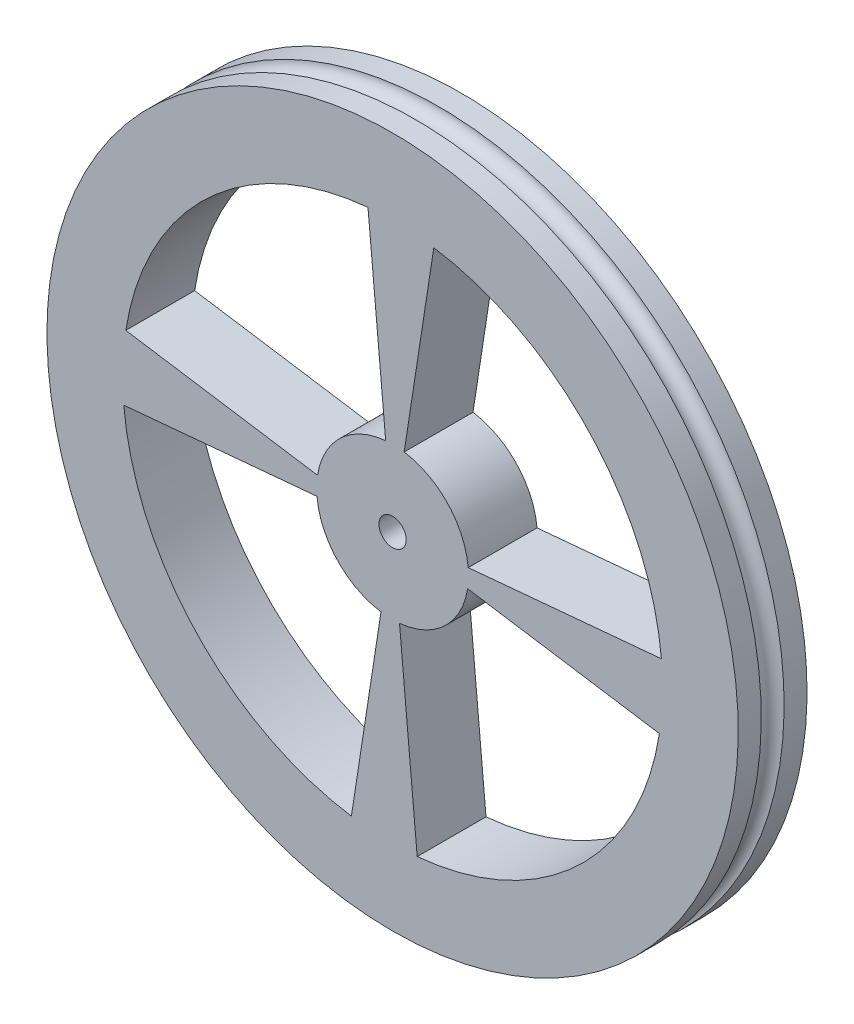
ISO-10303-21;
HEADER;
FILE_DESCRIPTION(('STEP AP214'),'2;1');
FILE_NAME('part.step','',(''),(''),'','','');
FILE_SCHEMA(('AUTOMOTIVE_DESIGN { 1 0 10303 214 1 1 1 1 }'));
ENDSEC;
DATA;
#1=APPLICATION_CONTEXT('core data for automotive mechanical design processes');
#2=APPLICATION_PROTOCOL_DEFINITION('international standard','automotive_design',2000,#1);
#3=PRODUCT_CONTEXT('',#1,'mechanical');
#4=PRODUCT('Part','Part','',(#3));
#5=PRODUCT_RELATED_PRODUCT_CATEGORY('part','',(#4));
#6=PRODUCT_DEFINITION_FORMATION('','',#4);
#7=PRODUCT_DEFINITION_CONTEXT('part definition',#1,'design');
#8=PRODUCT_DEFINITION('design','',#6,#7);
#9=PRODUCT_DEFINITION_SHAPE('','',#8);
#10=(LENGTH_UNIT() NAMED_UNIT(*) SI_UNIT(.MILLI.,.METRE.));
#11=(NAMED_UNIT(*) PLANE_ANGLE_UNIT() SI_UNIT($,.RADIAN.));
#12=(NAMED_UNIT(*) SI_UNIT($,.STERADIAN.) SOLID_ANGLE_UNIT());
#13=UNCERTAINTY_MEASURE_WITH_UNIT(LENGTH_MEASURE(1.E-05),#10,'distance_accuracy_value','');
#14=(GEOMETRIC_REPRESENTATION_CONTEXT(3) GLOBAL_UNCERTAINTY_ASSIGNED_CONTEXT((#13)) GLOBAL_UNIT_ASSIGNED_CONTEXT((#10,
#11,#12)) REPRESENTATION_CONTEXT('',''));
#15=CARTESIAN_POINT('',(0.,0.,0.));
#16=DIRECTION('',(0.,0.,1.));
#17=DIRECTION('',(1.,0.,0.));
#18=AXIS2_PLACEMENT_3D('',#15,#16,#17);
#19=CARTESIAN_POINT('',(0.,53.34,0.));
#20=DIRECTION('',(0.,0.,1.));
#21=DIRECTION('',(0.,-1.,0.));
#22=AXIS2_PLACEMENT_3D('',#19,#20,#21);
#23=CYLINDRICAL_SURFACE('',#22,53.34);
#24=CARTESIAN_POINT('',(0.,53.34,-3.54940000000003));
#25=DIRECTION('',(0.,0.,1.));
#26=DIRECTION('',(0.,-1.,0.));
#27=AXIS2_PLACEMENT_3D('',#24,#25,#26);
#28=CIRCLE('',#27,53.34);
#29=CARTESIAN_POINT('',(0.,0.,-3.5494));
#30=VERTEX_POINT('',#29);
#31=EDGE_CURVE('E11',#30,#30,#28,.T.);
#32=ORIENTED_EDGE('',*,*,#31,.T.);
#33=EDGE_LOOP('',(#32));
#34=FACE_BOUND('',#33,.T.);
#35=CARTESIAN_POINT('',(0.,53.34,0.));
#36=DIRECTION('',(0.,0.,1.));
#37=DIRECTION('',(0.,-1.,0.));
#38=AXIS2_PLACEMENT_3D('',#35,#36,#37);
#39=CIRCLE('',#38,53.34);
#40=CARTESIAN_POINT('',(0.,0.,0.));
#41=VERTEX_POINT('',#40);
#42=EDGE_CURVE('E340',#41,#41,#39,.T.);
#43=ORIENTED_EDGE('',*,*,#42,.F.);
#44=EDGE_LOOP('',(#43));
#45=FACE_BOUND('',#44,.T.);
#46=ADVANCED_FACE('F39',(#34,#45),#23,.T.);
#47=CARTESIAN_POINT('',(0.,53.34,-5.31470000000003));
#48=DIRECTION('',(0.,0.,1.));
#49=DIRECTION('',(0.,-1.,0.));
#50=AXIS2_PLACEMENT_3D('',#47,#48,#49);
#51=TOROIDAL_SURFACE('',#50,53.34,1.7653);
#52=CARTESIAN_POINT('',(0.,53.34,-7.08000000000003));
#53=DIRECTION('',(0.,0.,1.));
#54=DIRECTION('',(0.,-1.,0.));
#55=AXIS2_PLACEMENT_3D('',#52,#53,#54);
#56=CIRCLE('',#55,53.34);
#57=CARTESIAN_POINT('',(0.,0.,-7.08));
#58=VERTEX_POINT('',#57);
#59=EDGE_CURVE('E47',#58,#58,#56,.T.);
#60=ORIENTED_EDGE('',*,*,#59,.T.);
#61=EDGE_LOOP('',(#60));
#62=FACE_BOUND('',#61,.T.);
#63=ORIENTED_EDGE('',*,*,#31,.F.);
#64=EDGE_LOOP('',(#63));
#65=FACE_BOUND('',#64,.T.);
#66=ADVANCED_FACE('F354',(#62,#65),#51,.F.);
#67=CARTESIAN_POINT('',(0.,53.34,0.));
#68=DIRECTION('',(0.,0.,1.));
#69=DIRECTION('',(0.,-1.,0.));
#70=AXIS2_PLACEMENT_3D('',#67,#68,#69);
#71=CYLINDRICAL_SURFACE('',#70,53.34);
#72=CARTESIAN_POINT('',(0.,53.34,-10.62));
#73=DIRECTION('',(0.,0.,1.));
#74=DIRECTION('',(0.,-1.,0.));
#75=AXIS2_PLACEMENT_3D('',#72,#73,#74);
#76=CIRCLE('',#75,53.34);
#77=CARTESIAN_POINT('',(0.,0.,-10.62));
#78=VERTEX_POINT('',#77);
#79=EDGE_CURVE('E347',#78,#78,#76,.T.);
#80=ORIENTED_EDGE('',*,*,#79,.T.);
#81=EDGE_LOOP('',(#80));
#82=FACE_BOUND('',#81,.T.);
#83=ORIENTED_EDGE('',*,*,#59,.F.);
#84=EDGE_LOOP('',(#83));
#85=FACE_BOUND('',#84,.T.);
#86=ADVANCED_FACE('F357',(#82,#85),#71,.T.);
#87=CARTESIAN_POINT('',(0.,53.34,-10.62));
#88=DIRECTION('',(0.,0.,-1.));
#89=DIRECTION('',(0.,1.,0.));
#90=AXIS2_PLACEMENT_3D('',#87,#88,#89);
#91=PLANE('',#90);
#92=CARTESIAN_POINT('',(0.,53.34,-10.62));
#93=DIRECTION('',(0.,0.,1.));
#94=DIRECTION('',(-1.,0.,0.));
#95=AXIS2_PLACEMENT_3D('',#92,#93,#94);
#96=CIRCLE('',#95,41.6566262161238);
#97=CARTESIAN_POINT('',(-3.79621608544961,94.823288817817,-10.62));
#98=VERTEX_POINT('',#97);
#99=CARTESIAN_POINT('',(-41.1684205391164,59.6989038382659,-10.62));
#100=VERTEX_POINT('',#99);
#101=EDGE_CURVE('E251',#98,#100,#96,.T.);
#102=ORIENTED_EDGE('',*,*,#101,.T.);
#103=DIRECTION('',(0.988280239631637,-0.1526504764278,0.));
#104=VECTOR('',#103,1.);
#105=CARTESIAN_POINT('',(-41.1684205391164,59.6989038382659,-10.62));
#106=LINE('',#105,#104);
#107=CARTESIAN_POINT('',(-11.5803918831355,55.128715657049,-10.62));
#108=VERTEX_POINT('',#107);
#109=EDGE_CURVE('E255',#100,#108,#106,.T.);
#110=ORIENTED_EDGE('',*,*,#109,.T.);
#111=CARTESIAN_POINT('',(0.,53.34,-10.62));
#112=DIRECTION('',(0.,0.,-1.));
#113=DIRECTION('',(1.,0.,0.));
#114=AXIS2_PLACEMENT_3D('',#111,#112,#113);
#115=CIRCLE('',#114,11.7177207625358);
#116=CARTESIAN_POINT('',(-1.06784932156422,65.0089621515882,-10.62));
#117=VERTEX_POINT('',#116);
#118=EDGE_CURVE('E54',#108,#117,#115,.T.);
#119=ORIENTED_EDGE('',*,*,#118,.T.);
#120=DIRECTION('',(-0.0911311459971366,0.995838899736925,0.));
#121=VECTOR('',#120,1.);
#122=CARTESIAN_POINT('',(-1.06784932156422,65.0089621515881,-10.62));
#123=LINE('',#122,#121);
#124=EDGE_CURVE('E262',#117,#98,#123,.T.);
#125=ORIENTED_EDGE('',*,*,#124,.T.);
#126=EDGE_LOOP('',(#102,#110,#119,#125));
#127=FACE_BOUND('',#126,.T.);
#128=CARTESIAN_POINT('',(0.,53.34,-10.62));
#129=DIRECTION('',(0.,0.,1.));
#130=DIRECTION('',(-1.,0.,0.));
#131=AXIS2_PLACEMENT_3D('',#128,#129,#130);
#132=CIRCLE('',#131,41.6566262161238);
#133=CARTESIAN_POINT('',(-41.4832888178169,49.5437839145501,-10.62));
#134=VERTEX_POINT('',#133);
#135=CARTESIAN_POINT('',(-6.35890383826564,12.1715794608834,-10.62));
#136=VERTEX_POINT('',#135);
#137=EDGE_CURVE('E209',#134,#136,#132,.T.);
#138=ORIENTED_EDGE('',*,*,#137,.T.);
#139=DIRECTION('',(0.152650476427797,0.988280239631637,0.));
#140=VECTOR('',#139,1.);
#141=CARTESIAN_POINT('',(-6.35890383826564,12.1715794608834,-10.62));
#142=LINE('',#141,#140);
#143=CARTESIAN_POINT('',(-1.78871565704901,41.7596081168643,-10.62));
#144=VERTEX_POINT('',#143);
#145=EDGE_CURVE('E213',#136,#144,#142,.T.);
#146=ORIENTED_EDGE('',*,*,#145,.T.);
#147=CARTESIAN_POINT('',(0.,53.34,-10.62));
#148=DIRECTION('',(0.,0.,-1.));
#149=DIRECTION('',(1.,0.,0.));
#150=AXIS2_PLACEMENT_3D('',#147,#148,#149);
#151=CIRCLE('',#150,11.7177207625358);
#152=CARTESIAN_POINT('',(-11.6689621515882,52.2721506784355,-10.62));
#153=VERTEX_POINT('',#152);
#154=EDGE_CURVE('E62',#144,#153,#151,.T.);
#155=ORIENTED_EDGE('',*,*,#154,.T.);
#156=DIRECTION('',(-0.995838899736924,-0.0911311459971401,0.));
#157=VECTOR('',#156,1.);
#158=CARTESIAN_POINT('',(-11.668962151588,52.2721506784356,-10.62));
#159=LINE('',#158,#157);
#160=EDGE_CURVE('E220',#153,#134,#159,.T.);
#161=ORIENTED_EDGE('',*,*,#160,.T.);
#162=EDGE_LOOP('',(#138,#146,#155,#161));
#163=FACE_BOUND('',#162,.T.);
#164=CARTESIAN_POINT('',(0.,53.34,-10.62));
#165=DIRECTION('',(0.,0.,1.));
#166=DIRECTION('',(-1.,0.,0.));
#167=AXIS2_PLACEMENT_3D('',#164,#165,#166);
#168=CIRCLE('',#167,41.656626216124);
#169=CARTESIAN_POINT('',(3.79621608545022,11.856711182183,-10.62));
#170=VERTEX_POINT('',#169);
#171=CARTESIAN_POINT('',(41.1684205391167,46.9810961617343,-10.62));
#172=VERTEX_POINT('',#171);
#173=EDGE_CURVE('E156',#170,#172,#168,.T.);
#174=ORIENTED_EDGE('',*,*,#173,.T.);
#175=DIRECTION('',(-0.988280239631638,0.152650476427793,0.));
#176=VECTOR('',#175,1.);
#177=CARTESIAN_POINT('',(41.1684205391167,46.9810961617343,-10.62));
#178=LINE('',#177,#176);
#179=CARTESIAN_POINT('',(11.5803918831359,51.551284342951,-10.62));
#180=VERTEX_POINT('',#179);
#181=EDGE_CURVE('E169',#172,#180,#178,.T.);
#182=ORIENTED_EDGE('',*,*,#181,.T.);
#183=CARTESIAN_POINT('',(0.,53.34,-10.62));
#184=DIRECTION('',(0.,0.,-1.));
#185=DIRECTION('',(1.,0.,0.));
#186=AXIS2_PLACEMENT_3D('',#183,#184,#185);
#187=CIRCLE('',#186,11.717720762536);
#188=CARTESIAN_POINT('',(1.06784932156463,41.6710378484117,-10.62));
#189=VERTEX_POINT('',#188);
#190=EDGE_CURVE('E174',#180,#189,#187,.T.);
#191=ORIENTED_EDGE('',*,*,#190,.T.);
#192=DIRECTION('',(0.0911311459971435,-0.995838899736924,0.));
#193=VECTOR('',#192,1.);
#194=CARTESIAN_POINT('',(1.06784932156462,41.6710378484118,-10.62));
#195=LINE('',#194,#193);
#196=EDGE_CURVE('E165',#189,#170,#195,.T.);
#197=ORIENTED_EDGE('',*,*,#196,.T.);
#198=EDGE_LOOP('',(#174,#182,#191,#197));
#199=FACE_BOUND('',#198,.T.);
#200=CARTESIAN_POINT('',(0.,53.34,-10.62));
#201=DIRECTION('',(0.,0.,1.));
#202=DIRECTION('',(-1.,0.,0.));
#203=AXIS2_PLACEMENT_3D('',#200,#201,#202);
#204=CIRCLE('',#203,41.6566262161239);
#205=CARTESIAN_POINT('',(41.4832888178172,57.1362160854502,-10.62));
#206=VERTEX_POINT('',#205);
#207=CARTESIAN_POINT('',(6.35890383826568,94.5084205391166,-10.62));
#208=VERTEX_POINT('',#207);
#209=EDGE_CURVE('E292',#206,#208,#204,.T.);
#210=ORIENTED_EDGE('',*,*,#209,.T.);
#211=DIRECTION('',(-0.15265047642779,-0.988280239631639,0.));
#212=VECTOR('',#211,1.);
#213=CARTESIAN_POINT('',(6.35890383826568,94.5084205391166,-10.62));
#214=LINE('',#213,#212);
#215=CARTESIAN_POINT('',(1.78871565704892,64.9203918831357,-10.62));
#216=VERTEX_POINT('',#215);
#217=EDGE_CURVE('E296',#208,#216,#214,.T.);
#218=ORIENTED_EDGE('',*,*,#217,.T.);
#219=CARTESIAN_POINT('',(0.,53.34,-10.62));
#220=DIRECTION('',(0.,0.,-1.));
#221=DIRECTION('',(1.,0.,0.));
#222=AXIS2_PLACEMENT_3D('',#219,#220,#221);
#223=CIRCLE('',#222,11.717720762536);
#224=CARTESIAN_POINT('',(11.6689621515883,54.4078493215645,-10.62));
#225=VERTEX_POINT('',#224);
#226=EDGE_CURVE('E301',#216,#225,#223,.T.);
#227=ORIENTED_EDGE('',*,*,#226,.T.);
#228=DIRECTION('',(0.995838899736924,0.091131145997147,0.));
#229=VECTOR('',#228,1.);
#230=CARTESIAN_POINT('',(11.6689621515883,54.4078493215645,-10.62));
#231=LINE('',#230,#229);
#232=EDGE_CURVE('E305',#225,#206,#231,.T.);
#233=ORIENTED_EDGE('',*,*,#232,.T.);
#234=EDGE_LOOP('',(#210,#218,#227,#233));
#235=FACE_BOUND('',#234,.T.);
#236=CARTESIAN_POINT('',(0.,53.34,-10.62));
#237=DIRECTION('',(0.,0.,1.));
#238=DIRECTION('',(1.,0.,0.));
#239=AXIS2_PLACEMENT_3D('',#236,#237,#238);
#240=CIRCLE('',#239,2.1);
#241=CARTESIAN_POINT('',(2.1,53.34,-10.62));
#242=VERTEX_POINT('',#241);
#243=EDGE_CURVE('E336',#242,#242,#240,.T.);
#244=ORIENTED_EDGE('',*,*,#243,.T.);
#245=EDGE_LOOP('',(#244));
#246=FACE_BOUND('',#245,.T.);
#247=ORIENTED_EDGE('',*,*,#79,.F.);
#248=EDGE_LOOP('',(#247));
#249=FACE_BOUND('',#248,.T.);
#250=ADVANCED_FACE('F176',(#127,#163,#199,#235,#246,#249),#91,.T.);
#251=CARTESIAN_POINT('',(0.,0.,0.));
#252=DIRECTION('',(0.,0.,1.));
#253=DIRECTION('',(0.,-1.,0.));
#254=AXIS2_PLACEMENT_3D('',#251,#252,#253);
#255=PLANE('',#254);
#256=CARTESIAN_POINT('',(0.,53.34,0.));
#257=DIRECTION('',(0.,0.,1.));
#258=DIRECTION('',(-1.,0.,0.));
#259=AXIS2_PLACEMENT_3D('',#256,#257,#258);
#260=CIRCLE('',#259,41.6566262161238);
#261=CARTESIAN_POINT('',(-3.79621608544961,94.823288817817,0.));
#262=VERTEX_POINT('',#261);
#263=CARTESIAN_POINT('',(-41.1684205391164,59.6989038382659,0.));
#264=VERTEX_POINT('',#263);
#265=EDGE_CURVE('E267',#262,#264,#260,.T.);
#266=ORIENTED_EDGE('',*,*,#265,.F.);
#267=DIRECTION('',(-0.0911311459971366,0.995838899736925,0.));
#268=VECTOR('',#267,1.);
#269=CARTESIAN_POINT('',(-1.06784932156422,65.0089621515881,0.));
#270=LINE('',#269,#268);
#271=CARTESIAN_POINT('',(-1.06784932156422,65.0089621515882,0.));
#272=VERTEX_POINT('',#271);
#273=EDGE_CURVE('E256',#272,#262,#270,.T.);
#274=ORIENTED_EDGE('',*,*,#273,.F.);
#275=CARTESIAN_POINT('',(0.,53.34,0.));
#276=DIRECTION('',(0.,0.,-1.));
#277=DIRECTION('',(1.,0.,0.));
#278=AXIS2_PLACEMENT_3D('',#275,#276,#277);
#279=CIRCLE('',#278,11.7177207625358);
#280=CARTESIAN_POINT('',(-11.5803918831355,55.1287156570488,0.));
#281=VERTEX_POINT('',#280);
#282=EDGE_CURVE('E274',#281,#272,#279,.T.);
#283=ORIENTED_EDGE('',*,*,#282,.F.);
#284=DIRECTION('',(0.988280239631637,-0.1526504764278,0.));
#285=VECTOR('',#284,1.);
#286=CARTESIAN_POINT('',(-41.1684205391164,59.6989038382659,0.));
#287=LINE('',#286,#285);
#288=EDGE_CURVE('E270',#264,#281,#287,.T.);
#289=ORIENTED_EDGE('',*,*,#288,.F.);
#290=EDGE_LOOP('',(#266,#274,#283,#289));
#291=FACE_BOUND('',#290,.T.);
#292=CARTESIAN_POINT('',(0.,53.34,0.));
#293=DIRECTION('',(0.,0.,1.));
#294=DIRECTION('',(-1.,0.,0.));
#295=AXIS2_PLACEMENT_3D('',#292,#293,#294);
#296=CIRCLE('',#295,41.6566262161238);
#297=CARTESIAN_POINT('',(-41.4832888178169,49.5437839145501,0.));
#298=VERTEX_POINT('',#297);
#299=CARTESIAN_POINT('',(-6.35890383826564,12.1715794608834,0.));
#300=VERTEX_POINT('',#299);
#301=EDGE_CURVE('E225',#298,#300,#296,.T.);
#302=ORIENTED_EDGE('',*,*,#301,.F.);
#303=DIRECTION('',(-0.995838899736924,-0.0911311459971401,0.));
#304=VECTOR('',#303,1.);
#305=CARTESIAN_POINT('',(-11.668962151588,52.2721506784356,0.));
#306=LINE('',#305,#304);
#307=CARTESIAN_POINT('',(-11.6689621515882,52.2721506784355,0.));
#308=VERTEX_POINT('',#307);
#309=EDGE_CURVE('E214',#308,#298,#306,.T.);
#310=ORIENTED_EDGE('',*,*,#309,.F.);
#311=CARTESIAN_POINT('',(0.,53.34,0.));
#312=DIRECTION('',(0.,0.,-1.));
#313=DIRECTION('',(1.,0.,0.));
#314=AXIS2_PLACEMENT_3D('',#311,#312,#313);
#315=CIRCLE('',#314,11.7177207625358);
#316=CARTESIAN_POINT('',(-1.78871565704868,41.7596081168643,0.));
#317=VERTEX_POINT('',#316);
#318=EDGE_CURVE('E233',#317,#308,#315,.T.);
#319=ORIENTED_EDGE('',*,*,#318,.F.);
#320=DIRECTION('',(0.152650476427797,0.988280239631637,0.));
#321=VECTOR('',#320,1.);
#322=CARTESIAN_POINT('',(-6.35890383826564,12.1715794608834,0.));
#323=LINE('',#322,#321);
#324=EDGE_CURVE('E228',#300,#317,#323,.T.);
#325=ORIENTED_EDGE('',*,*,#324,.F.);
#326=EDGE_LOOP('',(#302,#310,#319,#325));
#327=FACE_BOUND('',#326,.T.);
#328=CARTESIAN_POINT('',(0.,53.34,0.));
#329=DIRECTION('',(0.,0.,1.));
#330=DIRECTION('',(-1.,0.,0.));
#331=AXIS2_PLACEMENT_3D('',#328,#329,#330);
#332=CIRCLE('',#331,41.656626216124);
#333=CARTESIAN_POINT('',(3.79621608545022,11.856711182183,0.));
#334=VERTEX_POINT('',#333);
#335=CARTESIAN_POINT('',(41.1684205391167,46.9810961617343,0.));
#336=VERTEX_POINT('',#335);
#337=EDGE_CURVE('E159',#334,#336,#332,.T.);
#338=ORIENTED_EDGE('',*,*,#337,.F.);
#339=DIRECTION('',(0.0911311459971435,-0.995838899736924,0.));
#340=VECTOR('',#339,1.);
#341=CARTESIAN_POINT('',(1.06784932156462,41.6710378484118,0.));
#342=LINE('',#341,#340);
#343=CARTESIAN_POINT('',(1.06784932156463,41.6710378484117,0.));
#344=VERTEX_POINT('',#343);
#345=EDGE_CURVE('E180',#344,#334,#342,.T.);
#346=ORIENTED_EDGE('',*,*,#345,.F.);
#347=CARTESIAN_POINT('',(0.,53.34,0.));
#348=DIRECTION('',(0.,0.,-1.));
#349=DIRECTION('',(1.,0.,0.));
#350=AXIS2_PLACEMENT_3D('',#347,#348,#349);
#351=CIRCLE('',#350,11.717720762536);
#352=CARTESIAN_POINT('',(11.5803918831359,51.5512843429512,0.));
#353=VERTEX_POINT('',#352);
#354=EDGE_CURVE('E184',#353,#344,#351,.T.);
#355=ORIENTED_EDGE('',*,*,#354,.F.);
#356=DIRECTION('',(-0.988280239631638,0.152650476427793,0.));
#357=VECTOR('',#356,1.);
#358=CARTESIAN_POINT('',(41.1684205391167,46.9810961617343,0.));
#359=LINE('',#358,#357);
#360=EDGE_CURVE('E193',#336,#353,#359,.T.);
#361=ORIENTED_EDGE('',*,*,#360,.F.);
#362=EDGE_LOOP('',(#338,#346,#355,#361));
#363=FACE_BOUND('',#362,.T.);
#364=CARTESIAN_POINT('',(0.,53.34,0.));
#365=DIRECTION('',(0.,0.,1.));
#366=DIRECTION('',(-1.,0.,0.));
#367=AXIS2_PLACEMENT_3D('',#364,#365,#366);
#368=CIRCLE('',#367,41.6566262161239);
#369=CARTESIAN_POINT('',(41.4832888178172,57.1362160854502,0.));
#370=VERTEX_POINT('',#369);
#371=CARTESIAN_POINT('',(6.35890383826568,94.5084205391166,0.));
#372=VERTEX_POINT('',#371);
#373=EDGE_CURVE('E203',#370,#372,#368,.T.);
#374=ORIENTED_EDGE('',*,*,#373,.F.);
#375=DIRECTION('',(0.995838899736924,0.091131145997147,0.));
#376=VECTOR('',#375,1.);
#377=CARTESIAN_POINT('',(11.6689621515883,54.4078493215645,0.));
#378=LINE('',#377,#376);
#379=CARTESIAN_POINT('',(11.6689621515883,54.4078493215645,0.));
#380=VERTEX_POINT('',#379);
#381=EDGE_CURVE('E297',#380,#370,#378,.T.);
#382=ORIENTED_EDGE('',*,*,#381,.F.);
#383=CARTESIAN_POINT('',(0.,53.34,0.));
#384=DIRECTION('',(0.,0.,-1.));
#385=DIRECTION('',(1.,0.,0.));
#386=AXIS2_PLACEMENT_3D('',#383,#384,#385);
#387=CIRCLE('',#386,11.717720762536);
#388=CARTESIAN_POINT('',(1.78871565704892,64.9203918831357,0.));
#389=VERTEX_POINT('',#388);
#390=EDGE_CURVE('E316',#389,#380,#387,.T.);
#391=ORIENTED_EDGE('',*,*,#390,.F.);
#392=DIRECTION('',(-0.15265047642779,-0.988280239631639,0.));
#393=VECTOR('',#392,1.);
#394=CARTESIAN_POINT('',(6.35890383826568,94.5084205391166,0.));
#395=LINE('',#394,#393);
#396=EDGE_CURVE('E312',#372,#389,#395,.T.);
#397=ORIENTED_EDGE('',*,*,#396,.F.);
#398=EDGE_LOOP('',(#374,#382,#391,#397));
#399=FACE_BOUND('',#398,.T.);
#400=CARTESIAN_POINT('',(0.,53.34,0.));
#401=DIRECTION('',(0.,0.,1.));
#402=DIRECTION('',(1.,0.,0.));
#403=AXIS2_PLACEMENT_3D('',#400,#401,#402);
#404=CIRCLE('',#403,2.1);
#405=CARTESIAN_POINT('',(2.1,53.34,0.));
#406=VERTEX_POINT('',#405);
#407=EDGE_CURVE('E326',#406,#406,#404,.T.);
#408=ORIENTED_EDGE('',*,*,#407,.F.);
#409=EDGE_LOOP('',(#408));
#410=FACE_BOUND('',#409,.T.);
#411=ORIENTED_EDGE('',*,*,#42,.T.);
#412=EDGE_LOOP('',(#411));
#413=FACE_BOUND('',#412,.T.);
#414=ADVANCED_FACE('F365',(#291,#327,#363,#399,#410,#413),#255,.T.);
#415=CARTESIAN_POINT('',(0.,53.34,-10.62));
#416=DIRECTION('',(0.,0.,1.));
#417=DIRECTION('',(1.,0.,0.));
#418=AXIS2_PLACEMENT_3D('',#415,#416,#417);
#419=CYLINDRICAL_SURFACE('',#418,2.1);
#420=ORIENTED_EDGE('',*,*,#243,.F.);
#421=EDGE_LOOP('',(#420));
#422=FACE_BOUND('',#421,.T.);
#423=ORIENTED_EDGE('',*,*,#407,.T.);
#424=EDGE_LOOP('',(#423));
#425=FACE_BOUND('',#424,.T.);
#426=ADVANCED_FACE('F377',(#422,#425),#419,.F.);
#427=CARTESIAN_POINT('',(0.,53.34,-10.62));
#428=DIRECTION('',(0.,0.,1.));
#429=DIRECTION('',(1.,0.,0.));
#430=AXIS2_PLACEMENT_3D('',#427,#428,#429);
#431=CYLINDRICAL_SURFACE('',#430,41.6566262161239);
#432=ORIENTED_EDGE('',*,*,#373,.T.);
#433=DIRECTION('',(0.,0.,1.));
#434=VECTOR('',#433,1.);
#435=CARTESIAN_POINT('',(6.35890383826568,94.5084205391166,-10.62));
#436=LINE('',#435,#434);
#437=EDGE_CURVE('E309',#208,#372,#436,.T.);
#438=ORIENTED_EDGE('',*,*,#437,.F.);
#439=ORIENTED_EDGE('',*,*,#209,.F.);
#440=DIRECTION('',(0.,0.,1.));
#441=VECTOR('',#440,1.);
#442=CARTESIAN_POINT('',(41.4832888178172,57.1362160854502,-10.62));
#443=LINE('',#442,#441);
#444=EDGE_CURVE('E323',#206,#370,#443,.T.);
#445=ORIENTED_EDGE('',*,*,#444,.T.);
#446=EDGE_LOOP('',(#432,#438,#439,#445));
#447=FACE_BOUND('',#446,.T.);
#448=ADVANCED_FACE('F383',(#447),#431,.F.);
#449=CARTESIAN_POINT('',(11.6689621515883,54.4078493215645,-10.62));
#450=DIRECTION('',(0.091131145997147,-0.995838899736924,0.));
#451=DIRECTION('',(0.995838899736924,0.091131145997147,0.));
#452=AXIS2_PLACEMENT_3D('',#449,#450,#451);
#453=PLANE('',#452);
#454=ORIENTED_EDGE('',*,*,#381,.T.);
#455=ORIENTED_EDGE('',*,*,#444,.F.);
#456=ORIENTED_EDGE('',*,*,#232,.F.);
#457=DIRECTION('',(0.,0.,1.));
#458=VECTOR('',#457,1.);
#459=CARTESIAN_POINT('',(11.6689621515883,54.4078493215645,-10.62));
#460=LINE('',#459,#458);
#461=EDGE_CURVE('E327',#225,#380,#460,.T.);
#462=ORIENTED_EDGE('',*,*,#461,.T.);
#463=EDGE_LOOP('',(#454,#455,#456,#462));
#464=FACE_BOUND('',#463,.T.);
#465=ADVANCED_FACE('F391',(#464),#453,.F.);
#466=CARTESIAN_POINT('',(0.,53.34,-10.62));
#467=DIRECTION('',(0.,0.,1.));
#468=DIRECTION('',(1.,0.,0.));
#469=AXIS2_PLACEMENT_3D('',#466,#467,#468);
#470=CYLINDRICAL_SURFACE('',#469,11.717720762536);
#471=ORIENTED_EDGE('',*,*,#390,.T.);
#472=ORIENTED_EDGE('',*,*,#461,.F.);
#473=ORIENTED_EDGE('',*,*,#226,.F.);
#474=DIRECTION('',(0.,0.,1.));
#475=VECTOR('',#474,1.);
#476=CARTESIAN_POINT('',(1.78871565704892,64.9203918831357,-10.62));
#477=LINE('',#476,#475);
#478=EDGE_CURVE('E330',#216,#389,#477,.T.);
#479=ORIENTED_EDGE('',*,*,#478,.T.);
#480=EDGE_LOOP('',(#471,#472,#473,#479));
#481=FACE_BOUND('',#480,.T.);
#482=ADVANCED_FACE('F396',(#481),#470,.T.);
#483=CARTESIAN_POINT('',(6.35890383826568,94.5084205391166,-10.62));
#484=DIRECTION('',(-0.988280239631639,0.15265047642779,0.));
#485=DIRECTION('',(-0.15265047642779,-0.988280239631639,0.));
#486=AXIS2_PLACEMENT_3D('',#483,#484,#485);
#487=PLANE('',#486);
#488=ORIENTED_EDGE('',*,*,#396,.T.);
#489=ORIENTED_EDGE('',*,*,#478,.F.);
#490=ORIENTED_EDGE('',*,*,#217,.F.);
#491=ORIENTED_EDGE('',*,*,#437,.T.);
#492=EDGE_LOOP('',(#488,#489,#490,#491));
#493=FACE_BOUND('',#492,.T.);
#494=ADVANCED_FACE('F393',(#493),#487,.F.);
#495=CARTESIAN_POINT('',(0.,53.34,-10.62));
#496=DIRECTION('',(0.,0.,1.));
#497=DIRECTION('',(1.,0.,0.));
#498=AXIS2_PLACEMENT_3D('',#495,#496,#497);
#499=CYLINDRICAL_SURFACE('',#498,41.656626216124);
#500=ORIENTED_EDGE('',*,*,#337,.T.);
#501=DIRECTION('',(0.,0.,1.));
#502=VECTOR('',#501,1.);
#503=CARTESIAN_POINT('',(41.1684205391167,46.9810961617343,-10.62));
#504=LINE('',#503,#502);
#505=EDGE_CURVE('E152',#172,#336,#504,.T.);
#506=ORIENTED_EDGE('',*,*,#505,.F.);
#507=ORIENTED_EDGE('',*,*,#173,.F.);
#508=DIRECTION('',(0.,0.,1.));
#509=VECTOR('',#508,1.);
#510=CARTESIAN_POINT('',(3.79621608545022,11.856711182183,-10.62));
#511=LINE('',#510,#509);
#512=EDGE_CURVE('E200',#170,#334,#511,.T.);
#513=ORIENTED_EDGE('',*,*,#512,.T.);
#514=EDGE_LOOP('',(#500,#506,#507,#513));
#515=FACE_BOUND('',#514,.T.);
#516=ADVANCED_FACE('F154',(#515),#499,.F.);
#517=CARTESIAN_POINT('',(1.06784932156462,41.6710378484118,-10.62));
#518=DIRECTION('',(-0.995838899736924,-0.0911311459971435,0.));
#519=DIRECTION('',(0.0911311459971435,-0.995838899736924,0.));
#520=AXIS2_PLACEMENT_3D('',#517,#518,#519);
#521=PLANE('',#520);
#522=ORIENTED_EDGE('',*,*,#345,.T.);
#523=ORIENTED_EDGE('',*,*,#512,.F.);
#524=ORIENTED_EDGE('',*,*,#196,.F.);
#525=DIRECTION('',(0.,0.,1.));
#526=VECTOR('',#525,1.);
#527=CARTESIAN_POINT('',(1.06784932156463,41.6710378484117,-10.62));
#528=LINE('',#527,#526);
#529=EDGE_CURVE('E204',#189,#344,#528,.T.);
#530=ORIENTED_EDGE('',*,*,#529,.T.);
#531=EDGE_LOOP('',(#522,#523,#524,#530));
#532=FACE_BOUND('',#531,.T.);
#533=ADVANCED_FACE('F436',(#532),#521,.F.);
#534=CARTESIAN_POINT('',(0.,53.34,-10.62));
#535=DIRECTION('',(0.,0.,1.));
#536=DIRECTION('',(1.,0.,0.));
#537=AXIS2_PLACEMENT_3D('',#534,#535,#536);
#538=CYLINDRICAL_SURFACE('',#537,11.717720762536);
#539=ORIENTED_EDGE('',*,*,#354,.T.);
#540=ORIENTED_EDGE('',*,*,#529,.F.);
#541=ORIENTED_EDGE('',*,*,#190,.F.);
#542=DIRECTION('',(0.,0.,1.));
#543=VECTOR('',#542,1.);
#544=CARTESIAN_POINT('',(11.5803918831359,51.5512843429512,-10.62));
#545=LINE('',#544,#543);
#546=EDGE_CURVE('E164',#180,#353,#545,.T.);
#547=ORIENTED_EDGE('',*,*,#546,.T.);
#548=EDGE_LOOP('',(#539,#540,#541,#547));
#549=FACE_BOUND('',#548,.T.);
#550=ADVANCED_FACE('F439',(#549),#538,.T.);
#551=CARTESIAN_POINT('',(41.1684205391167,46.9810961617343,-10.62));
#552=DIRECTION('',(0.152650476427793,0.988280239631638,0.));
#553=DIRECTION('',(-0.988280239631638,0.152650476427793,0.));
#554=AXIS2_PLACEMENT_3D('',#551,#552,#553);
#555=PLANE('',#554);
#556=ORIENTED_EDGE('',*,*,#360,.T.);
#557=ORIENTED_EDGE('',*,*,#546,.F.);
#558=ORIENTED_EDGE('',*,*,#181,.F.);
#559=ORIENTED_EDGE('',*,*,#505,.T.);
#560=EDGE_LOOP('',(#556,#557,#558,#559));
#561=FACE_BOUND('',#560,.T.);
#562=ADVANCED_FACE('F170',(#561),#555,.F.);
#563=CARTESIAN_POINT('',(0.,53.34,-10.62));
#564=DIRECTION('',(0.,0.,1.));
#565=DIRECTION('',(1.,0.,0.));
#566=AXIS2_PLACEMENT_3D('',#563,#564,#565);
#567=CYLINDRICAL_SURFACE('',#566,41.6566262161238);
#568=ORIENTED_EDGE('',*,*,#301,.T.);
#569=DIRECTION('',(0.,0.,1.));
#570=VECTOR('',#569,1.);
#571=CARTESIAN_POINT('',(-6.35890383826564,12.1715794608834,-10.62));
#572=LINE('',#571,#570);
#573=EDGE_CURVE('E224',#136,#300,#572,.T.);
#574=ORIENTED_EDGE('',*,*,#573,.F.);
#575=ORIENTED_EDGE('',*,*,#137,.F.);
#576=DIRECTION('',(0.,0.,1.));
#577=VECTOR('',#576,1.);
#578=CARTESIAN_POINT('',(-41.4832888178169,49.5437839145501,-10.62));
#579=LINE('',#578,#577);
#580=EDGE_CURVE('E194',#134,#298,#579,.T.);
#581=ORIENTED_EDGE('',*,*,#580,.T.);
#582=EDGE_LOOP('',(#568,#574,#575,#581));
#583=FACE_BOUND('',#582,.T.);
#584=ADVANCED_FACE('F420',(#583),#567,.F.);
#585=CARTESIAN_POINT('',(-11.668962151588,52.2721506784356,-10.62));
#586=DIRECTION('',(-0.0911311459971401,0.995838899736924,0.));
#587=DIRECTION('',(-0.995838899736924,-0.0911311459971401,0.));
#588=AXIS2_PLACEMENT_3D('',#585,#586,#587);
#589=PLANE('',#588);
#590=ORIENTED_EDGE('',*,*,#309,.T.);
#591=ORIENTED_EDGE('',*,*,#580,.F.);
#592=ORIENTED_EDGE('',*,*,#160,.F.);
#593=DIRECTION('',(0.,0.,1.));
#594=VECTOR('',#593,1.);
#595=CARTESIAN_POINT('',(-11.6689621515882,52.2721506784355,-10.62));
#596=LINE('',#595,#594);
#597=EDGE_CURVE('E242',#153,#308,#596,.T.);
#598=ORIENTED_EDGE('',*,*,#597,.T.);
#599=EDGE_LOOP('',(#590,#591,#592,#598));
#600=FACE_BOUND('',#599,.T.);
#601=ADVANCED_FACE('F423',(#600),#589,.F.);
#602=CARTESIAN_POINT('',(0.,53.34,-10.62));
#603=DIRECTION('',(0.,0.,1.));
#604=DIRECTION('',(1.,0.,0.));
#605=AXIS2_PLACEMENT_3D('',#602,#603,#604);
#606=CYLINDRICAL_SURFACE('',#605,11.7177207625358);
#607=ORIENTED_EDGE('',*,*,#318,.T.);
#608=ORIENTED_EDGE('',*,*,#597,.F.);
#609=ORIENTED_EDGE('',*,*,#154,.F.);
#610=DIRECTION('',(0.,0.,1.));
#611=VECTOR('',#610,1.);
#612=CARTESIAN_POINT('',(-1.78871565704868,41.7596081168643,-10.62));
#613=LINE('',#612,#611);
#614=EDGE_CURVE('E245',#144,#317,#613,.T.);
#615=ORIENTED_EDGE('',*,*,#614,.T.);
#616=EDGE_LOOP('',(#607,#608,#609,#615));
#617=FACE_BOUND('',#616,.T.);
#618=ADVANCED_FACE('F427',(#617),#606,.T.);
#619=CARTESIAN_POINT('',(-6.35890383826564,12.1715794608834,-10.62));
#620=DIRECTION('',(0.988280239631637,-0.152650476427797,0.));
#621=DIRECTION('',(0.152650476427797,0.988280239631637,0.));
#622=AXIS2_PLACEMENT_3D('',#619,#620,#621);
#623=PLANE('',#622);
#624=ORIENTED_EDGE('',*,*,#324,.T.);
#625=ORIENTED_EDGE('',*,*,#614,.F.);
#626=ORIENTED_EDGE('',*,*,#145,.F.);
#627=ORIENTED_EDGE('',*,*,#573,.T.);
#628=EDGE_LOOP('',(#624,#625,#626,#627));
#629=FACE_BOUND('',#628,.T.);
#630=ADVANCED_FACE('F408',(#629),#623,.F.);
#631=CARTESIAN_POINT('',(0.,53.34,-10.62));
#632=DIRECTION('',(0.,0.,1.));
#633=DIRECTION('',(1.,0.,0.));
#634=AXIS2_PLACEMENT_3D('',#631,#632,#633);
#635=CYLINDRICAL_SURFACE('',#634,41.6566262161238);
#636=ORIENTED_EDGE('',*,*,#265,.T.);
#637=DIRECTION('',(0.,0.,1.));
#638=VECTOR('',#637,1.);
#639=CARTESIAN_POINT('',(-41.1684205391164,59.6989038382659,-10.62));
#640=LINE('',#639,#638);
#641=EDGE_CURVE('E266',#100,#264,#640,.T.);
#642=ORIENTED_EDGE('',*,*,#641,.F.);
#643=ORIENTED_EDGE('',*,*,#101,.F.);
#644=DIRECTION('',(0.,0.,1.));
#645=VECTOR('',#644,1.);
#646=CARTESIAN_POINT('',(-3.79621608544961,94.823288817817,-10.62));
#647=LINE('',#646,#645);
#648=EDGE_CURVE('E229',#98,#262,#647,.T.);
#649=ORIENTED_EDGE('',*,*,#648,.T.);
#650=EDGE_LOOP('',(#636,#642,#643,#649));
#651=FACE_BOUND('',#650,.T.);
#652=ADVANCED_FACE('F404',(#651),#635,.F.);
#653=CARTESIAN_POINT('',(-1.06784932156422,65.0089621515881,-10.62));
#654=DIRECTION('',(0.995838899736925,0.0911311459971367,0.));
#655=DIRECTION('',(-0.0911311459971367,0.995838899736925,0.));
#656=AXIS2_PLACEMENT_3D('',#653,#654,#655);
#657=PLANE('',#656);
#658=ORIENTED_EDGE('',*,*,#273,.T.);
#659=ORIENTED_EDGE('',*,*,#648,.F.);
#660=ORIENTED_EDGE('',*,*,#124,.F.);
#661=DIRECTION('',(0.,0.,1.));
#662=VECTOR('',#661,1.);
#663=CARTESIAN_POINT('',(-1.06784932156422,65.0089621515882,-10.62));
#664=LINE('',#663,#662);
#665=EDGE_CURVE('E283',#117,#272,#664,.T.);
#666=ORIENTED_EDGE('',*,*,#665,.T.);
#667=EDGE_LOOP('',(#658,#659,#660,#666));
#668=FACE_BOUND('',#667,.T.);
#669=ADVANCED_FACE('F407',(#668),#657,.F.);
#670=CARTESIAN_POINT('',(0.,53.34,-10.62));
#671=DIRECTION('',(0.,0.,1.));
#672=DIRECTION('',(1.,0.,0.));
#673=AXIS2_PLACEMENT_3D('',#670,#671,#672);
#674=CYLINDRICAL_SURFACE('',#673,11.7177207625358);
#675=ORIENTED_EDGE('',*,*,#282,.T.);
#676=ORIENTED_EDGE('',*,*,#665,.F.);
#677=ORIENTED_EDGE('',*,*,#118,.F.);
#678=DIRECTION('',(0.,0.,1.));
#679=VECTOR('',#678,1.);
#680=CARTESIAN_POINT('',(-11.5803918831355,55.1287156570488,-10.62));
#681=LINE('',#680,#679);
#682=EDGE_CURVE('E286',#108,#281,#681,.T.);
#683=ORIENTED_EDGE('',*,*,#682,.T.);
#684=EDGE_LOOP('',(#675,#676,#677,#683));
#685=FACE_BOUND('',#684,.T.);
#686=ADVANCED_FACE('F413',(#685),#674,.T.);
#687=CARTESIAN_POINT('',(-41.1684205391164,59.6989038382659,-10.62));
#688=DIRECTION('',(-0.1526504764278,-0.988280239631637,0.));
#689=DIRECTION('',(0.988280239631637,-0.1526504764278,0.));
#690=AXIS2_PLACEMENT_3D('',#687,#688,#689);
#691=PLANE('',#690);
#692=ORIENTED_EDGE('',*,*,#288,.T.);
#693=ORIENTED_EDGE('',*,*,#682,.F.);
#694=ORIENTED_EDGE('',*,*,#109,.F.);
#695=ORIENTED_EDGE('',*,*,#641,.T.);
#696=EDGE_LOOP('',(#692,#693,#694,#695));
#697=FACE_BOUND('',#696,.T.);
#698=ADVANCED_FACE('F410',(#697),#691,.F.);
#699=CLOSED_SHELL('',(#46,#66,#86,#250,#414,#426,#448,#465,#482,#494,#516,#533,#550,#562,#584,
#601,#618,#630,#652,#669,#686,#698));
#700=MANIFOLD_SOLID_BREP('B2',#699);
#701=ADVANCED_BREP_SHAPE_REPRESENTATION('',(#18,#700),#14);
#702=SHAPE_DEFINITION_REPRESENTATION(#9,#701);
ENDSEC;
END-ISO-10303-21;
